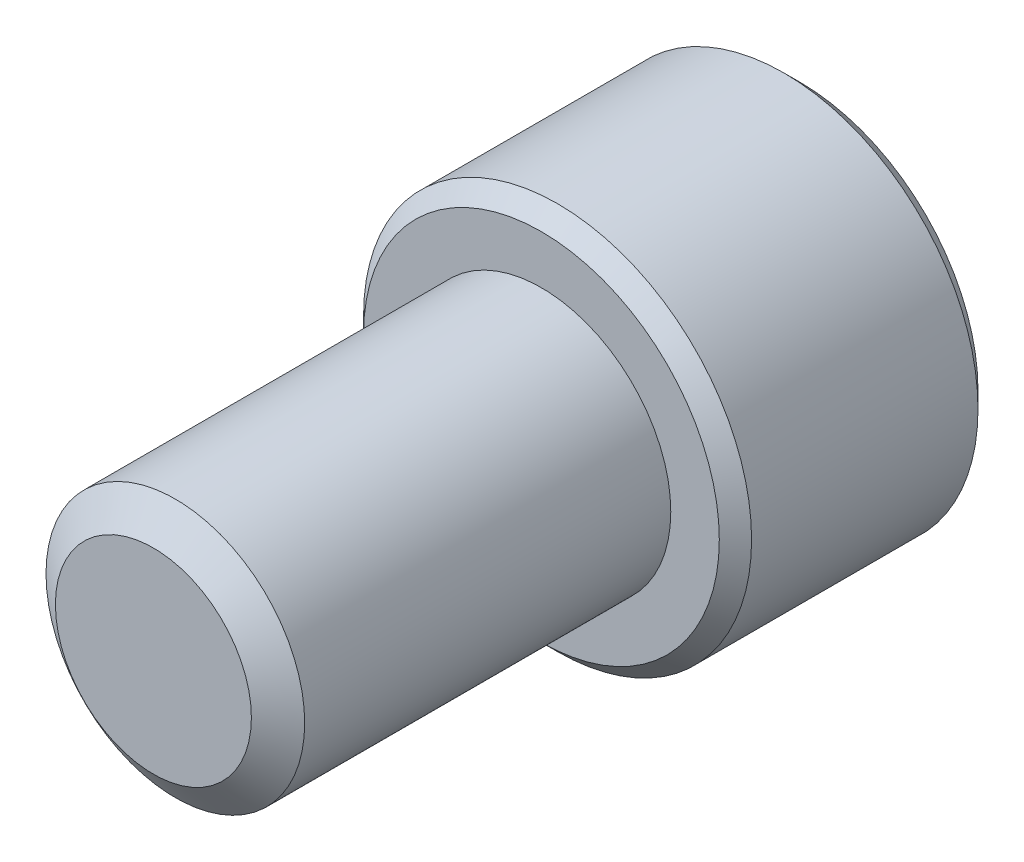
ISO-10303-21;
HEADER;
FILE_DESCRIPTION(('STEP AP214'),'2;1');
FILE_NAME('part.step','',(''),(''),'','','');
FILE_SCHEMA(('AUTOMOTIVE_DESIGN { 1 0 10303 214 1 1 1 1 }'));
ENDSEC;
DATA;
#1=APPLICATION_CONTEXT('core data for automotive mechanical design processes');
#2=APPLICATION_PROTOCOL_DEFINITION('international standard','automotive_design',2000,#1);
#3=PRODUCT_CONTEXT('',#1,'mechanical');
#4=PRODUCT('Part','Part','',(#3));
#5=PRODUCT_RELATED_PRODUCT_CATEGORY('part','',(#4));
#6=PRODUCT_DEFINITION_FORMATION('','',#4);
#7=PRODUCT_DEFINITION_CONTEXT('part definition',#1,'design');
#8=PRODUCT_DEFINITION('design','',#6,#7);
#9=PRODUCT_DEFINITION_SHAPE('','',#8);
#10=(LENGTH_UNIT() NAMED_UNIT(*) SI_UNIT(.MILLI.,.METRE.));
#11=(NAMED_UNIT(*) PLANE_ANGLE_UNIT() SI_UNIT($,.RADIAN.));
#12=(NAMED_UNIT(*) SI_UNIT($,.STERADIAN.) SOLID_ANGLE_UNIT());
#13=UNCERTAINTY_MEASURE_WITH_UNIT(LENGTH_MEASURE(1.E-05),#10,'distance_accuracy_value','');
#14=(GEOMETRIC_REPRESENTATION_CONTEXT(3) GLOBAL_UNCERTAINTY_ASSIGNED_CONTEXT((#13)) GLOBAL_UNIT_ASSIGNED_CONTEXT((#10,
#11,#12)) REPRESENTATION_CONTEXT('',''));
#15=CARTESIAN_POINT('',(0.,0.,0.));
#16=DIRECTION('',(0.,0.,1.));
#17=DIRECTION('',(1.,0.,0.));
#18=AXIS2_PLACEMENT_3D('',#15,#16,#17);
#19=CARTESIAN_POINT('',(0.,0.,-6.35));
#20=DIRECTION('',(0.,0.,1.));
#21=DIRECTION('',(1.,0.,0.));
#22=AXIS2_PLACEMENT_3D('',#19,#20,#21);
#23=PLANE('',#22);
#24=CARTESIAN_POINT('',(0.,0.,-6.35));
#25=DIRECTION('',(0.,0.,1.));
#26=DIRECTION('',(1.,0.,0.));
#27=AXIS2_PLACEMENT_3D('',#24,#25,#26);
#28=CIRCLE('',#27,4.36626);
#29=CARTESIAN_POINT('',(4.36626,0.,-6.35));
#30=VERTEX_POINT('',#29);
#31=EDGE_CURVE('E11',#30,#30,#28,.F.);
#32=ORIENTED_EDGE('',*,*,#31,.T.);
#33=EDGE_LOOP('',(#32));
#34=FACE_BOUND('',#33,.T.);
#35=CARTESIAN_POINT('',(0.,0.,-6.35));
#36=DIRECTION('',(0.,0.,-1.));
#37=DIRECTION('',(-1.,0.,0.));
#38=AXIS2_PLACEMENT_3D('',#35,#36,#37);
#39=CIRCLE('',#38,2.74963065701559);
#40=CARTESIAN_POINT('',(2.38125,1.3748153285078,-6.35));
#41=VERTEX_POINT('',#40);
#42=CARTESIAN_POINT('',(2.38125,-1.3748153285078,-6.35));
#43=VERTEX_POINT('',#42);
#44=EDGE_CURVE('E61',#41,#43,#39,.T.);
#45=ORIENTED_EDGE('',*,*,#44,.F.);
#46=CARTESIAN_POINT('',(0.,2.74963065701559,-6.35));
#47=VERTEX_POINT('',#46);
#48=EDGE_CURVE('E143',#47,#41,#39,.T.);
#49=ORIENTED_EDGE('',*,*,#48,.F.);
#50=CARTESIAN_POINT('',(-2.38125,1.3748153285078,-6.35));
#51=VERTEX_POINT('',#50);
#52=EDGE_CURVE('E138',#51,#47,#39,.T.);
#53=ORIENTED_EDGE('',*,*,#52,.F.);
#54=CARTESIAN_POINT('',(-2.38125,-1.3748153285078,-6.35));
#55=VERTEX_POINT('',#54);
#56=EDGE_CURVE('E102',#55,#51,#39,.T.);
#57=ORIENTED_EDGE('',*,*,#56,.F.);
#58=CARTESIAN_POINT('',(0.,-2.74963065701559,-6.35));
#59=VERTEX_POINT('',#58);
#60=EDGE_CURVE('E93',#59,#55,#39,.T.);
#61=ORIENTED_EDGE('',*,*,#60,.F.);
#62=EDGE_CURVE('E54',#43,#59,#39,.T.);
#63=ORIENTED_EDGE('',*,*,#62,.F.);
#64=EDGE_LOOP('',(#45,#49,#53,#57,#61,#63));
#65=FACE_BOUND('',#64,.T.);
#66=ADVANCED_FACE('F39',(#34,#65),#23,.F.);
#67=CARTESIAN_POINT('',(0.,0.,9.525));
#68=DIRECTION('',(0.,0.,-1.));
#69=DIRECTION('',(-1.,0.,0.));
#70=AXIS2_PLACEMENT_3D('',#67,#68,#69);
#71=CYLINDRICAL_SURFACE('',#70,3.175);
#72=CARTESIAN_POINT('',(0.,0.,8.98615127117986));
#73=DIRECTION('',(0.,0.,-1.));
#74=DIRECTION('',(-1.,0.,0.));
#75=AXIS2_PLACEMENT_3D('',#72,#73,#74);
#76=CIRCLE('',#75,3.175);
#77=CARTESIAN_POINT('',(-3.175,0.,8.98615127117986));
#78=VERTEX_POINT('',#77);
#79=EDGE_CURVE('E185',#78,#78,#76,.T.);
#80=CARTESIAN_POINT('',(0.,0.,0.));
#81=DIRECTION('',(0.,0.,1.));
#82=DIRECTION('',(1.,0.,0.));
#83=AXIS2_PLACEMENT_3D('',#80,#81,#82);
#84=CIRCLE('',#83,3.175);
#85=CARTESIAN_POINT('',(-3.175,0.,0.));
#86=VERTEX_POINT('',#85);
#87=EDGE_CURVE('E184',#86,#86,#84,.T.);
#88=CARTESIAN_POINT('',(-3.175,0.,8.98615127117986));
#89=CARTESIAN_POINT('',(-3.175,0.,8.89254552877174));
#90=CARTESIAN_POINT('',(-3.175,0.,8.79893978636361));
#91=CARTESIAN_POINT('',(-3.175,0.,8.61172830154737));
#92=CARTESIAN_POINT('',(-3.175,0.,8.51812255913924));
#93=CARTESIAN_POINT('',(-3.175,0.,8.330911074323));
#94=CARTESIAN_POINT('',(-3.175,0.,8.23730533191487));
#95=CARTESIAN_POINT('',(-3.175,0.,8.05009384709862));
#96=CARTESIAN_POINT('',(-3.175,0.,7.9564881046905));
#97=CARTESIAN_POINT('',(-3.175,0.,7.76927661987425));
#98=CARTESIAN_POINT('',(-3.175,0.,7.67567087746613));
#99=CARTESIAN_POINT('',(-3.175,0.,7.48845939264988));
#100=CARTESIAN_POINT('',(-3.175,0.,7.39485365024176));
#101=CARTESIAN_POINT('',(-3.175,0.,7.20764216542551));
#102=CARTESIAN_POINT('',(-3.175,0.,7.11403642301739));
#103=CARTESIAN_POINT('',(-3.175,0.,6.92682493820114));
#104=CARTESIAN_POINT('',(-3.175,0.,6.83321919579302));
#105=CARTESIAN_POINT('',(-3.175,0.,6.64600771097677));
#106=CARTESIAN_POINT('',(-3.175,0.,6.55240196856865));
#107=CARTESIAN_POINT('',(-3.175,0.,6.3651904837524));
#108=CARTESIAN_POINT('',(-3.175,0.,6.27158474134428));
#109=CARTESIAN_POINT('',(-3.175,0.,6.08437325652803));
#110=CARTESIAN_POINT('',(-3.175,0.,5.99076751411991));
#111=CARTESIAN_POINT('',(-3.175,0.,5.80355602930366));
#112=CARTESIAN_POINT('',(-3.175,0.,5.70995028689554));
#113=CARTESIAN_POINT('',(-3.175,0.,5.52273880207929));
#114=CARTESIAN_POINT('',(-3.175,0.,5.42913305967117));
#115=CARTESIAN_POINT('',(-3.175,0.,5.24192157485492));
#116=CARTESIAN_POINT('',(-3.175,0.,5.1483158324468));
#117=CARTESIAN_POINT('',(-3.175,0.,4.96110434763055));
#118=CARTESIAN_POINT('',(-3.175,0.,4.86749860522242));
#119=CARTESIAN_POINT('',(-3.175,0.,4.68028712040618));
#120=CARTESIAN_POINT('',(-3.175,0.,4.58668137799805));
#121=CARTESIAN_POINT('',(-3.175,0.,4.39946989318181));
#122=CARTESIAN_POINT('',(-3.175,0.,4.30586415077368));
#123=CARTESIAN_POINT('',(-3.175,0.,4.11865266595744));
#124=CARTESIAN_POINT('',(-3.175,0.,4.02504692354931));
#125=CARTESIAN_POINT('',(-3.175,0.,3.83783543873307));
#126=CARTESIAN_POINT('',(-3.175,0.,3.74422969632494));
#127=CARTESIAN_POINT('',(-3.175,0.,3.55701821150869));
#128=CARTESIAN_POINT('',(-3.175,0.,3.46341246910057));
#129=CARTESIAN_POINT('',(-3.175,0.,3.27620098428432));
#130=CARTESIAN_POINT('',(-3.175,0.,3.1825952418762));
#131=CARTESIAN_POINT('',(-3.175,0.,2.99538375705995));
#132=CARTESIAN_POINT('',(-3.175,0.,2.90177801465183));
#133=CARTESIAN_POINT('',(-3.175,0.,2.71456652983558));
#134=CARTESIAN_POINT('',(-3.175,0.,2.62096078742746));
#135=CARTESIAN_POINT('',(-3.175,0.,2.43374930261121));
#136=CARTESIAN_POINT('',(-3.175,0.,2.34014356020309));
#137=CARTESIAN_POINT('',(-3.175,0.,2.15293207538684));
#138=CARTESIAN_POINT('',(-3.175,0.,2.05932633297872));
#139=CARTESIAN_POINT('',(-3.175,0.,1.87211484816247));
#140=CARTESIAN_POINT('',(-3.175,0.,1.77850910575435));
#141=CARTESIAN_POINT('',(-3.175,0.,1.5912976209381));
#142=CARTESIAN_POINT('',(-3.175,0.,1.49769187852998));
#143=CARTESIAN_POINT('',(-3.175,0.,1.31048039371373));
#144=CARTESIAN_POINT('',(-3.175,0.,1.21687465130561));
#145=CARTESIAN_POINT('',(-3.175,0.,1.02966316648936));
#146=CARTESIAN_POINT('',(-3.175,0.,0.936057424081235));
#147=CARTESIAN_POINT('',(-3.175,0.,0.748845939264988));
#148=CARTESIAN_POINT('',(-3.175,0.,0.655240196856864));
#149=CARTESIAN_POINT('',(-3.175,0.,0.468028712040617));
#150=CARTESIAN_POINT('',(-3.175,0.,0.374422969632494));
#151=CARTESIAN_POINT('',(-3.175,0.,0.187211484816247));
#152=CARTESIAN_POINT('',(-3.175,0.,0.0936057424081236));
#153=CARTESIAN_POINT('',(-3.175,0.,0.));
#154=B_SPLINE_CURVE_WITH_KNOTS('',3,(#88,#89,#90,#91,#92,#93,#94,#95,#96,#97,#98,#99,#100,#101,
#102,#103,#104,#105,#106,#107,#108,#109,#110,#111,#112,#113,#114,#115,#116,#117,#118,#119,#120,
#121,#122,#123,#124,#125,#126,#127,#128,#129,#130,#131,#132,#133,#134,#135,#136,#137,#138,#139,
#140,#141,#142,#143,#144,#145,#146,#147,#148,#149,#150,#151,#152,#153),.UNSPECIFIED.,.F.,.F.,(4,
2,2,2,2,2,2,2,2,2,2,2,2,2,2,2,2,2,2,2,2,2,2,2,2,2,2,2,2,2,2,2,4),(0.,0.28081722722437,
0.561634454448741,0.842451681673111,1.12326890889748,1.40408613612185,1.68490336334622,
1.96572059057059,2.24653781779496,2.52735504501933,2.80817227224371,3.08898949946808,
3.36980672669245,3.65062395391682,3.93144118114119,4.21225840836556,4.49307563558993,
4.7738928628143,5.05471009003867,5.33552731726304,5.61634454448741,5.89716177171178,
6.17797899893615,6.45879622616052,6.73961345338489,7.02043068060926,7.30124790783363,
7.58206513505801,7.86288236228238,8.14369958950675,8.42451681673112,8.70533404395549,
8.98615127117986),.UNSPECIFIED.);
#155=EDGE_CURVE('BSEAM255',#78,#86,#154,.T.);
#156=ORIENTED_EDGE('',*,*,#79,.T.);
#157=ORIENTED_EDGE('',*,*,#87,.T.);
#158=ORIENTED_EDGE('',*,*,#155,.T.);
#159=ORIENTED_EDGE('',*,*,#155,.F.);
#160=EDGE_LOOP('',(#156,#158,#157,#159));
#161=FACE_BOUND('',#160,.T.);
#162=ADVANCED_FACE('F255',(#161),#71,.T.);
#163=CARTESIAN_POINT('',(0.,0.,9.525));
#164=DIRECTION('',(0.,0.,-1.));
#165=DIRECTION('',(-1.,0.,0.));
#166=AXIS2_PLACEMENT_3D('',#163,#164,#165);
#167=CONICAL_SURFACE('',#166,2.405444262,0.959931088596877);
#168=ORIENTED_EDGE('',*,*,#79,.F.);
#169=EDGE_LOOP('',(#168));
#170=FACE_BOUND('',#169,.T.);
#171=CARTESIAN_POINT('',(0.,0.,9.525));
#172=DIRECTION('',(0.,0.,-1.));
#173=DIRECTION('',(-1.,0.,0.));
#174=AXIS2_PLACEMENT_3D('',#171,#172,#173);
#175=CIRCLE('',#174,2.405444262);
#176=CARTESIAN_POINT('',(-2.405444262,0.,9.525));
#177=VERTEX_POINT('',#176);
#178=EDGE_CURVE('E115',#177,#177,#175,.T.);
#179=ORIENTED_EDGE('',*,*,#178,.T.);
#180=EDGE_LOOP('',(#179));
#181=FACE_BOUND('',#180,.T.);
#182=ADVANCED_FACE('F265',(#170,#181),#167,.T.);
#183=CARTESIAN_POINT('',(0.,0.,9.525));
#184=DIRECTION('',(0.,0.,1.));
#185=DIRECTION('',(1.,0.,0.));
#186=AXIS2_PLACEMENT_3D('',#183,#184,#185);
#187=PLANE('',#186);
#188=ORIENTED_EDGE('',*,*,#178,.F.);
#189=EDGE_LOOP('',(#188));
#190=FACE_BOUND('',#189,.T.);
#191=ADVANCED_FACE('F263',(#190),#187,.T.);
#192=CARTESIAN_POINT('',(0.,0.,-6.35));
#193=DIRECTION('',(0.,0.,1.));
#194=DIRECTION('',(1.,0.,0.));
#195=AXIS2_PLACEMENT_3D('',#192,#193,#194);
#196=CYLINDRICAL_SURFACE('',#195,4.7625);
#197=CARTESIAN_POINT('',(0.,0.,-0.396239999999996));
#198=DIRECTION('',(0.,0.,1.));
#199=DIRECTION('',(1.,0.,0.));
#200=AXIS2_PLACEMENT_3D('',#197,#198,#199);
#201=CIRCLE('',#200,4.7625);
#202=CARTESIAN_POINT('',(4.7625,0.,-0.396239999999997));
#203=VERTEX_POINT('',#202);
#204=EDGE_CURVE('E48',#203,#203,#201,.F.);
#205=CARTESIAN_POINT('',(0.,0.,-5.95376));
#206=DIRECTION('',(0.,0.,1.));
#207=DIRECTION('',(1.,0.,0.));
#208=AXIS2_PLACEMENT_3D('',#205,#206,#207);
#209=CIRCLE('',#208,4.7625);
#210=CARTESIAN_POINT('',(4.7625,0.,-5.95376));
#211=VERTEX_POINT('',#210);
#212=EDGE_CURVE('E286',#211,#211,#209,.T.);
#213=CARTESIAN_POINT('',(4.7625,0.,-0.396239999999997));
#214=CARTESIAN_POINT('',(4.7625,0.,-0.454130833333331));
#215=CARTESIAN_POINT('',(4.7625,0.,-0.512021666666664));
#216=CARTESIAN_POINT('',(4.7625,0.,-0.627803333333331));
#217=CARTESIAN_POINT('',(4.7625,0.,-0.685694166666665));
#218=CARTESIAN_POINT('',(4.7625,0.,-0.801475833333331));
#219=CARTESIAN_POINT('',(4.7625,0.,-0.859366666666665));
#220=CARTESIAN_POINT('',(4.7625,0.,-0.975148333333332));
#221=CARTESIAN_POINT('',(4.7625,0.,-1.03303916666667));
#222=CARTESIAN_POINT('',(4.7625,0.,-1.14882083333333));
#223=CARTESIAN_POINT('',(4.7625,0.,-1.20671166666666));
#224=CARTESIAN_POINT('',(4.7625,0.,-1.32249333333333));
#225=CARTESIAN_POINT('',(4.7625,0.,-1.38038416666666));
#226=CARTESIAN_POINT('',(4.7625,0.,-1.49616583333333));
#227=CARTESIAN_POINT('',(4.7625,0.,-1.55405666666667));
#228=CARTESIAN_POINT('',(4.7625,0.,-1.66983833333333));
#229=CARTESIAN_POINT('',(4.7625,0.,-1.72772916666667));
#230=CARTESIAN_POINT('',(4.7625,0.,-1.84351083333333));
#231=CARTESIAN_POINT('',(4.7625,0.,-1.90140166666667));
#232=CARTESIAN_POINT('',(4.7625,0.,-2.01718333333333));
#233=CARTESIAN_POINT('',(4.7625,0.,-2.07507416666667));
#234=CARTESIAN_POINT('',(4.7625,0.,-2.19085583333333));
#235=CARTESIAN_POINT('',(4.7625,0.,-2.24874666666667));
#236=CARTESIAN_POINT('',(4.7625,0.,-2.36452833333333));
#237=CARTESIAN_POINT('',(4.7625,0.,-2.42241916666667));
#238=CARTESIAN_POINT('',(4.7625,0.,-2.53820083333333));
#239=CARTESIAN_POINT('',(4.7625,0.,-2.59609166666667));
#240=CARTESIAN_POINT('',(4.7625,0.,-2.71187333333333));
#241=CARTESIAN_POINT('',(4.7625,0.,-2.76976416666667));
#242=CARTESIAN_POINT('',(4.7625,0.,-2.88554583333333));
#243=CARTESIAN_POINT('',(4.7625,0.,-2.94343666666667));
#244=CARTESIAN_POINT('',(4.7625,0.,-3.05921833333333));
#245=CARTESIAN_POINT('',(4.7625,0.,-3.11710916666667));
#246=CARTESIAN_POINT('',(4.7625,0.,-3.23289083333333));
#247=CARTESIAN_POINT('',(4.7625,0.,-3.29078166666667));
#248=CARTESIAN_POINT('',(4.7625,0.,-3.40656333333333));
#249=CARTESIAN_POINT('',(4.7625,0.,-3.46445416666667));
#250=CARTESIAN_POINT('',(4.7625,0.,-3.58023583333333));
#251=CARTESIAN_POINT('',(4.7625,0.,-3.63812666666667));
#252=CARTESIAN_POINT('',(4.7625,0.,-3.75390833333333));
#253=CARTESIAN_POINT('',(4.7625,0.,-3.81179916666667));
#254=CARTESIAN_POINT('',(4.7625,0.,-3.92758083333333));
#255=CARTESIAN_POINT('',(4.7625,0.,-3.98547166666667));
#256=CARTESIAN_POINT('',(4.7625,0.,-4.10125333333333));
#257=CARTESIAN_POINT('',(4.7625,0.,-4.15914416666667));
#258=CARTESIAN_POINT('',(4.7625,0.,-4.27492583333334));
#259=CARTESIAN_POINT('',(4.7625,0.,-4.33281666666667));
#260=CARTESIAN_POINT('',(4.7625,0.,-4.44859833333334));
#261=CARTESIAN_POINT('',(4.7625,0.,-4.50648916666667));
#262=CARTESIAN_POINT('',(4.7625,0.,-4.62227083333334));
#263=CARTESIAN_POINT('',(4.7625,0.,-4.68016166666667));
#264=CARTESIAN_POINT('',(4.7625,0.,-4.79594333333334));
#265=CARTESIAN_POINT('',(4.7625,0.,-4.85383416666667));
#266=CARTESIAN_POINT('',(4.7625,0.,-4.96961583333334));
#267=CARTESIAN_POINT('',(4.7625,0.,-5.02750666666667));
#268=CARTESIAN_POINT('',(4.7625,0.,-5.14328833333334));
#269=CARTESIAN_POINT('',(4.7625,0.,-5.20117916666667));
#270=CARTESIAN_POINT('',(4.7625,0.,-5.31696083333334));
#271=CARTESIAN_POINT('',(4.7625,0.,-5.37485166666667));
#272=CARTESIAN_POINT('',(4.7625,0.,-5.49063333333334));
#273=CARTESIAN_POINT('',(4.7625,0.,-5.54852416666667));
#274=CARTESIAN_POINT('',(4.7625,0.,-5.66430583333334));
#275=CARTESIAN_POINT('',(4.7625,0.,-5.72219666666667));
#276=CARTESIAN_POINT('',(4.7625,0.,-5.83797833333334));
#277=CARTESIAN_POINT('',(4.7625,0.,-5.89586916666667));
#278=CARTESIAN_POINT('',(4.7625,0.,-5.95376));
#279=B_SPLINE_CURVE_WITH_KNOTS('',3,(#213,#214,#215,#216,#217,#218,#219,#220,#221,#222,#223,
#224,#225,#226,#227,#228,#229,#230,#231,#232,#233,#234,#235,#236,#237,#238,#239,#240,#241,#242,
#243,#244,#245,#246,#247,#248,#249,#250,#251,#252,#253,#254,#255,#256,#257,#258,#259,#260,#261,
#262,#263,#264,#265,#266,#267,#268,#269,#270,#271,#272,#273,#274,#275,#276,#277,#278),
.UNSPECIFIED.,.F.,.F.,(4,2,2,2,2,2,2,2,2,2,2,2,2,2,2,2,2,2,2,2,2,2,2,2,2,2,2,2,2,2,2,2,4),(0.,
0.1736725,0.347345000000001,0.521017500000001,0.694690000000001,0.868362500000001,1.042035,
1.2157075,1.38938,1.5630525,1.736725,1.9103975,2.08407,2.2577425,2.431415,2.6050875,2.77876,
2.9524325,3.126105,3.2997775,3.47345,3.6471225,3.820795,3.9944675,4.16814000000001,4.3418125,
4.51548500000001,4.68915750000001,4.86283000000001,5.03650250000001,5.21017500000001,
5.38384750000001,5.55752000000001),.UNSPECIFIED.);
#280=EDGE_CURVE('BSEAM259',#203,#211,#279,.T.);
#281=ORIENTED_EDGE('',*,*,#204,.T.);
#282=ORIENTED_EDGE('',*,*,#212,.T.);
#283=ORIENTED_EDGE('',*,*,#280,.T.);
#284=ORIENTED_EDGE('',*,*,#280,.F.);
#285=EDGE_LOOP('',(#281,#283,#282,#284));
#286=FACE_BOUND('',#285,.T.);
#287=ADVANCED_FACE('F259',(#286),#196,.T.);
#288=CARTESIAN_POINT('',(0.,0.,0.));
#289=DIRECTION('',(0.,0.,1.));
#290=DIRECTION('',(1.,0.,0.));
#291=AXIS2_PLACEMENT_3D('',#288,#289,#290);
#292=PLANE('',#291);
#293=CARTESIAN_POINT('',(0.,0.,0.));
#294=DIRECTION('',(0.,0.,1.));
#295=DIRECTION('',(1.,0.,0.));
#296=AXIS2_PLACEMENT_3D('',#293,#294,#295);
#297=CIRCLE('',#296,4.36626000000001);
#298=CARTESIAN_POINT('',(4.36626000000001,0.,0.));
#299=VERTEX_POINT('',#298);
#300=EDGE_CURVE('E114',#299,#299,#297,.T.);
#301=ORIENTED_EDGE('',*,*,#300,.T.);
#302=EDGE_LOOP('',(#301));
#303=FACE_BOUND('',#302,.T.);
#304=ORIENTED_EDGE('',*,*,#87,.F.);
#305=EDGE_LOOP('',(#304));
#306=FACE_BOUND('',#305,.T.);
#307=ADVANCED_FACE('F208',(#303,#306),#292,.T.);
#308=CARTESIAN_POINT('',(0.,0.,-6.35));
#309=DIRECTION('',(0.,0.,-1.));
#310=DIRECTION('',(-1.,0.,0.));
#311=AXIS2_PLACEMENT_3D('',#308,#309,#310);
#312=CONICAL_SURFACE('',#311,2.74963065701559,0.78539816339745);
#313=CARTESIAN_POINT('',(-2.38125,5.26358029517608,-9.37753379332385));
#314=CARTESIAN_POINT('',(-2.38125,5.10930015251038,-9.23701195380244));
#315=CARTESIAN_POINT('',(-2.38125,4.95453392247456,-9.09701540692856));
#316=CARTESIAN_POINT('',(-2.38125,4.64362340229069,-8.8184808663705));
#317=CARTESIAN_POINT('',(-2.38125,4.48747876533903,-8.67994326015878));
#318=CARTESIAN_POINT('',(-2.38125,4.17229413784948,-8.40376426129823));
#319=CARTESIAN_POINT('',(-2.38125,4.0132411687696,-8.26613764041314));
#320=CARTESIAN_POINT('',(-2.38125,3.6928582645039,-7.99359517937762));
#321=CARTESIAN_POINT('',(-2.38125,3.53152864477141,-7.85867896983008));
#322=CARTESIAN_POINT('',(-2.38125,3.22909694198146,-7.61172002820002));
#323=CARTESIAN_POINT('',(-2.38125,3.08841030103137,-7.49917072205403));
#324=CARTESIAN_POINT('',(-2.38125,2.80401035625448,-7.27798053470262));
#325=CARTESIAN_POINT('',(-2.38125,2.66029739371072,-7.16933921648988));
#326=CARTESIAN_POINT('',(-2.38125,2.36895316972996,-6.95778146982453));
#327=CARTESIAN_POINT('',(-2.38125,2.22132743946684,-6.85485753656519));
#328=CARTESIAN_POINT('',(-2.38125,1.99575042508842,-6.7068446959238));
#329=CARTESIAN_POINT('',(-2.38125,1.91988689481301,-6.65857998640861));
#330=CARTESIAN_POINT('',(-2.38125,1.76653746568371,-6.56471055220513));
#331=CARTESIAN_POINT('',(-2.38125,1.68905175736512,-6.51910551747663));
#332=CARTESIAN_POINT('',(-2.38125,1.53466949771021,-6.43261398827359));
#333=CARTESIAN_POINT('',(-2.38125,1.45783175198454,-6.39162390648106));
#334=CARTESIAN_POINT('',(-2.38125,1.30220313555207,-6.31358558318694));
#335=CARTESIAN_POINT('',(-2.38125,1.22341213776886,-6.27653759898802));
#336=CARTESIAN_POINT('',(-2.38125,0.983971040100566,-6.1729000313569));
#337=CARTESIAN_POINT('',(-2.38125,0.819876024913719,-6.11359488919417));
#338=CARTESIAN_POINT('',(-2.38125,0.583490005408386,-6.05117681972876));
#339=CARTESIAN_POINT('',(-2.38125,0.514439171440969,-6.03559321718339));
#340=CARTESIAN_POINT('',(-2.38125,0.375316872822723,-6.01004712525619));
#341=CARTESIAN_POINT('',(-2.38125,0.305245933302838,-6.00008184180396));
#342=CARTESIAN_POINT('',(-2.38125,0.164625272615633,-5.98627960171868));
#343=CARTESIAN_POINT('',(-2.38125,0.0940766563827995,-5.98243151251386));
#344=CARTESIAN_POINT('',(-2.38125,-0.047085282951928,-5.98103899869873));
#345=CARTESIAN_POINT('',(-2.38125,-0.117698606778287,-5.98349464554862));
#346=CARTESIAN_POINT('',(-2.38125,-0.258256812705483,-5.99456009749715));
#347=CARTESIAN_POINT('',(-2.38125,-0.328202919931849,-6.00315459238653));
#348=CARTESIAN_POINT('',(-2.38125,-0.467159413671166,-6.02604217972058));
#349=CARTESIAN_POINT('',(-2.38125,-0.536169580360191,-6.04033658772999));
#350=CARTESIAN_POINT('',(-2.38125,-0.673108303706323,-6.07403203979735));
#351=CARTESIAN_POINT('',(-2.38125,-0.741033552658904,-6.09344636572186));
#352=CARTESIAN_POINT('',(-2.38125,-0.875457064039382,-6.13665094363754));
#353=CARTESIAN_POINT('',(-2.38125,-0.941955399224988,-6.16044097191868));
#354=CARTESIAN_POINT('',(-2.38125,-1.09720553188353,-6.22094477258879));
#355=CARTESIAN_POINT('',(-2.38125,-1.18534380866603,-6.25922682410383));
#356=CARTESIAN_POINT('',(-2.38125,-1.35912797059635,-6.34111766976522));
#357=CARTESIAN_POINT('',(-2.38125,-1.44477250822192,-6.3847292800045));
#358=CARTESIAN_POINT('',(-2.38125,-1.61399334296077,-6.47617325206604));
#359=CARTESIAN_POINT('',(-2.38125,-1.69756491320114,-6.52401429490893));
#360=CARTESIAN_POINT('',(-2.38125,-1.8627460255093,-6.6229181508464));
#361=CARTESIAN_POINT('',(-2.38125,-1.94435590729217,-6.67398040047642));
#362=CARTESIAN_POINT('',(-2.38125,-2.10678198772294,-6.7792077300195));
#363=CARTESIAN_POINT('',(-2.38125,-2.18758041921084,-6.83340010959865));
#364=CARTESIAN_POINT('',(-2.38125,-2.34775005808866,-6.9438596011435));
#365=CARTESIAN_POINT('',(-2.38125,-2.42712114832578,-7.00012688226639));
#366=CARTESIAN_POINT('',(-2.38125,-2.66323146084262,-7.17127257527606));
#367=CARTESIAN_POINT('',(-2.38125,-2.81817146870916,-7.28862982679241));
#368=CARTESIAN_POINT('',(-2.38125,-3.17313503051944,-7.56562022097031));
#369=CARTESIAN_POINT('',(-2.38125,-3.37188789584745,-7.72686629825722));
#370=CARTESIAN_POINT('',(-2.38125,-3.7654499045081,-8.05425683146461));
#371=CARTESIAN_POINT('',(-2.38125,-3.96025709131236,-8.22040362181233));
#372=CARTESIAN_POINT('',(-2.38125,-4.34091047965594,-8.5506422019652));
#373=CARTESIAN_POINT('',(-2.38125,-4.5268450884815,-8.71463243608961));
#374=CARTESIAN_POINT('',(-2.38125,-4.80421320104173,-8.96218760206474));
#375=CARTESIAN_POINT('',(-2.38125,-4.89637855982019,-9.0449355980209));
#376=CARTESIAN_POINT('',(-2.38125,-5.08028307881721,-9.21090072213519));
#377=CARTESIAN_POINT('',(-2.38125,-5.17202224651516,-9.29411784200333));
#378=CARTESIAN_POINT('',(-2.38125,-5.26358029517609,-9.37753379332385));
#379=B_SPLINE_CURVE_WITH_KNOTS('',3,(#313,#314,#315,#316,#317,#318,#319,#320,#321,#322,#323,
#324,#325,#326,#327,#328,#329,#330,#331,#332,#333,#334,#335,#336,#337,#338,#339,#340,#341,#342,
#343,#344,#345,#346,#347,#348,#349,#350,#351,#352,#353,#354,#355,#356,#357,#358,#359,#360,#361,
#362,#363,#364,#365,#366,#367,#368,#369,#370,#371,#372,#373,#374,#375,#376,#377,#378),
.UNSPECIFIED.,.F.,.F.,(4,2,2,2,2,2,2,2,2,2,2,2,2,2,2,2,2,2,2,2,2,2,2,2,2,2,2,2,2,2,2,2,4),(0.,
0.626057424372391,1.252277126859,1.883247459247,2.5141312063009,3.0545811320318,3.5949704333503,
4.1346327752944,4.40433562020152,4.6740069625509,4.93515363363657,5.19631733945355,
5.71733835300007,5.92951506380543,6.14158616281034,6.35327087377645,6.56495798444603,
6.77611898529682,6.98732875126098,7.19909191210817,7.41084424946199,7.69888178894536,
7.98707218845073,8.27586848513108,8.56461440390024,8.8564420804433,9.14829360118405,
9.7312641134934,10.4989529499474,11.2670135719832,12.0107502436479,12.3823337365477,
12.7539106835658),.UNSPECIFIED.);
#380=EDGE_CURVE('E107',#51,#55,#379,.T.);
#381=ORIENTED_EDGE('',*,*,#380,.T.);
#382=ORIENTED_EDGE('',*,*,#56,.T.);
#383=EDGE_LOOP('',(#381,#382));
#384=FACE_BOUND('',#383,.T.);
#385=ADVANCED_FACE('F108',(#384),#312,.F.);
#386=CARTESIAN_POINT('',(0.000199999999999783,2.74974612706943,-6.35011547732724));
#387=CARTESIAN_POINT('',(-0.0816567823790502,2.70248609172789,-6.30289489670954));
#388=CARTESIAN_POINT('',(-0.16488233377176,2.65443579722785,-6.2584475752929));
#389=CARTESIAN_POINT('',(-0.33458848083804,2.556455907536,-6.17706545698558));
#390=CARTESIAN_POINT('',(-0.421085217353102,2.50651699342501,-6.14017594309514));
#391=CARTESIAN_POINT('',(-0.595501774009041,2.40581754748857,-6.07698341316591));
#392=CARTESIAN_POINT('',(-0.683377171180674,2.35508266327639,-6.05052155872948));
#393=CARTESIAN_POINT('',(-0.861062594070875,2.25249593653966,-6.00975151561606));
#394=CARTESIAN_POINT('',(-0.95086719118587,2.20064722822085,-5.99541289153055));
#395=CARTESIAN_POINT('',(-1.10563960313034,2.11128933452158,-5.98247578477011));
#396=CARTESIAN_POINT('',(-1.17040744896962,2.07389560129144,-5.98056060465318));
#397=CARTESIAN_POINT('',(-1.29983727933557,1.99916925388849,-5.98378662276768));
#398=CARTESIAN_POINT('',(-1.36449921879335,1.96183666573622,-5.98893029485709));
#399=CARTESIAN_POINT('',(-1.4932125485774,1.88752399013711,-6.00598131087164));
#400=CARTESIAN_POINT('',(-1.55726317423485,1.85054434417201,-6.01789622134933));
#401=CARTESIAN_POINT('',(-1.68425683890527,1.77722451768917,-6.04783567235203));
#402=CARTESIAN_POINT('',(-1.74719996243582,1.74088428837517,-6.06585974451845));
#403=CARTESIAN_POINT('',(-1.90842615073218,1.64780030516185,-6.11936880755241));
#404=CARTESIAN_POINT('',(-2.00570949128784,1.59163374230437,-6.15888742087218));
#405=CARTESIAN_POINT('',(-2.14875606262557,1.50904576583588,-6.2256003435508));
#406=CARTESIAN_POINT('',(-2.19589628894396,1.48182934348129,-6.24904020911133));
#407=CARTESIAN_POINT('',(-2.28930352636664,1.42790064981105,-6.29805667665953));
#408=CARTESIAN_POINT('',(-2.33557105249682,1.40118808114506,-6.32363196676685));
#409=CARTESIAN_POINT('',(-2.38145,1.37469985845396,-6.35011547732724));
#410=B_SPLINE_CURVE_WITH_KNOTS('',3,(#386,#387,#388,#389,#390,#391,#392,#393,#394,#395,#396,
#397,#398,#399,#400,#401,#402,#403,#404,#405,#406,#407,#408,#409),.UNSPECIFIED.,.F.,.F.,(4,2,2,
2,2,2,2,2,2,2,2,4),(0.,0.317196610611949,0.636241461041217,0.95021895062922,1.26340583824126,
1.48752413747844,1.71172100167747,1.93616888974082,2.16059957440836,2.51709639744763,
2.69486147369099,2.87251813383154),.UNSPECIFIED.);
#411=EDGE_CURVE('E142',#47,#51,#410,.T.);
#412=ORIENTED_EDGE('',*,*,#411,.T.);
#413=ORIENTED_EDGE('',*,*,#52,.T.);
#414=EDGE_LOOP('',(#412,#413));
#415=FACE_BOUND('',#414,.T.);
#416=ADVANCED_FACE('F207',(#415),#312,.F.);
#417=CARTESIAN_POINT('',(2.38145,1.37469985845396,-6.35011547732724));
#418=CARTESIAN_POINT('',(2.29959321762095,1.4219598937955,-6.30289489670954));
#419=CARTESIAN_POINT('',(2.21636766622824,1.47001018829554,-6.2584475752929));
#420=CARTESIAN_POINT('',(2.04666151916196,1.56799007798739,-6.17706545698558));
#421=CARTESIAN_POINT('',(1.9601647826469,1.61792899209838,-6.14017594309514));
#422=CARTESIAN_POINT('',(1.78574822599096,1.71862843803482,-6.07698341316591));
#423=CARTESIAN_POINT('',(1.69787282881933,1.769363322247,-6.05052155872948));
#424=CARTESIAN_POINT('',(1.52018740592913,1.87195004898373,-6.00975151561606));
#425=CARTESIAN_POINT('',(1.43038280881413,1.92379875730254,-5.99541289153055));
#426=CARTESIAN_POINT('',(1.27561039686966,2.01315665100181,-5.98247578477011));
#427=CARTESIAN_POINT('',(1.21084255103038,2.05055038423195,-5.98056060465318));
#428=CARTESIAN_POINT('',(1.08141272066443,2.1252767316349,-5.98378662276768));
#429=CARTESIAN_POINT('',(1.01675078120665,2.16260931978717,-5.98893029485709));
#430=CARTESIAN_POINT('',(0.888037451422604,2.23692199538628,-6.00598131087164));
#431=CARTESIAN_POINT('',(0.823986825765147,2.27390164135138,-6.01789622134933));
#432=CARTESIAN_POINT('',(0.696993161094728,2.34722146783422,-6.04783567235203));
#433=CARTESIAN_POINT('',(0.634050037564177,2.38356169714822,-6.06585974451845));
#434=CARTESIAN_POINT('',(0.472823849267819,2.47664568036154,-6.11936880755241));
#435=CARTESIAN_POINT('',(0.375540508712161,2.53281224321902,-6.15888742087218));
#436=CARTESIAN_POINT('',(0.23249393737443,2.61540021968751,-6.2256003435508));
#437=CARTESIAN_POINT('',(0.185353711056036,2.64261664204209,-6.24904020911133));
#438=CARTESIAN_POINT('',(0.0919464736333616,2.69654533571233,-6.29805667665954));
#439=CARTESIAN_POINT('',(0.0456789475031782,2.72325790437833,-6.32363196676685));
#440=CARTESIAN_POINT('',(-0.000200000000000541,2.74974612706943,-6.35011547732724));
#441=B_SPLINE_CURVE_WITH_KNOTS('',3,(#417,#418,#419,#420,#421,#422,#423,#424,#425,#426,#427,
#428,#429,#430,#431,#432,#433,#434,#435,#436,#437,#438,#439,#440),.UNSPECIFIED.,.F.,.F.,(4,2,2,
2,2,2,2,2,2,2,2,4),(0.,0.317196610611949,0.636241461041218,0.950218950629222,1.26340583824126,
1.48752413747844,1.71172100167747,1.93616888974082,2.16059957440836,2.51709639744763,
2.69486147369099,2.87251813383154),.UNSPECIFIED.);
#442=EDGE_CURVE('E148',#41,#47,#441,.T.);
#443=ORIENTED_EDGE('',*,*,#442,.T.);
#444=ORIENTED_EDGE('',*,*,#48,.T.);
#445=EDGE_LOOP('',(#443,#444));
#446=FACE_BOUND('',#445,.T.);
#447=ADVANCED_FACE('F153',(#446),#312,.F.);
#448=CARTESIAN_POINT('',(2.38125,-5.26358029517608,-9.37753379332385));
#449=CARTESIAN_POINT('',(2.38125,-5.10930015251038,-9.23701195380244));
#450=CARTESIAN_POINT('',(2.38125,-4.95453392247456,-9.09701540692856));
#451=CARTESIAN_POINT('',(2.38125,-4.64362340229069,-8.8184808663705));
#452=CARTESIAN_POINT('',(2.38125,-4.48747876533903,-8.67994326015878));
#453=CARTESIAN_POINT('',(2.38125,-4.17229413784948,-8.40376426129823));
#454=CARTESIAN_POINT('',(2.38125,-4.01324116876961,-8.26613764041314));
#455=CARTESIAN_POINT('',(2.38125,-3.6928582645039,-7.99359517937762));
#456=CARTESIAN_POINT('',(2.38125,-3.53152864477141,-7.85867896983008));
#457=CARTESIAN_POINT('',(2.38125,-3.22909694198147,-7.61172002820002));
#458=CARTESIAN_POINT('',(2.38125,-3.08841030103137,-7.49917072205403));
#459=CARTESIAN_POINT('',(2.38125,-2.80401035625448,-7.27798053470262));
#460=CARTESIAN_POINT('',(2.38125,-2.66029739371072,-7.16933921648988));
#461=CARTESIAN_POINT('',(2.38125,-2.36895316972996,-6.95778146982453));
#462=CARTESIAN_POINT('',(2.38125,-2.22132743946685,-6.85485753656519));
#463=CARTESIAN_POINT('',(2.38125,-1.99575042508842,-6.7068446959238));
#464=CARTESIAN_POINT('',(2.38125,-1.91988689481301,-6.65857998640861));
#465=CARTESIAN_POINT('',(2.38125,-1.76653746568372,-6.56471055220514));
#466=CARTESIAN_POINT('',(2.38125,-1.68905175736512,-6.51910551747663));
#467=CARTESIAN_POINT('',(2.38125,-1.53466949771022,-6.43261398827359));
#468=CARTESIAN_POINT('',(2.38125,-1.45783175198455,-6.39162390648107));
#469=CARTESIAN_POINT('',(2.38125,-1.30220313555207,-6.31358558318694));
#470=CARTESIAN_POINT('',(2.38125,-1.22341213776886,-6.27653759898802));
#471=CARTESIAN_POINT('',(2.38125,-0.983971040100569,-6.1729000313569));
#472=CARTESIAN_POINT('',(2.38125,-0.819876024913721,-6.11359488919417));
#473=CARTESIAN_POINT('',(2.38125,-0.583490005408389,-6.05117681972876));
#474=CARTESIAN_POINT('',(2.38125,-0.514439171440971,-6.03559321718339));
#475=CARTESIAN_POINT('',(2.38125,-0.375316872822725,-6.01004712525619));
#476=CARTESIAN_POINT('',(2.38125,-0.30524593330284,-6.00008184180396));
#477=CARTESIAN_POINT('',(2.38125,-0.164625272615635,-5.98627960171868));
#478=CARTESIAN_POINT('',(2.38125,-0.0940766563828018,-5.98243151251386));
#479=CARTESIAN_POINT('',(2.38125,0.0470852829519256,-5.98103899869873));
#480=CARTESIAN_POINT('',(2.38125,0.117698606778285,-5.98349464554862));
#481=CARTESIAN_POINT('',(2.38125,0.258256812705481,-5.99456009749715));
#482=CARTESIAN_POINT('',(2.38125,0.328202919931847,-6.00315459238653));
#483=CARTESIAN_POINT('',(2.38125,0.467159413671164,-6.02604217972058));
#484=CARTESIAN_POINT('',(2.38125,0.536169580360189,-6.04033658772999));
#485=CARTESIAN_POINT('',(2.38125,0.673108303706321,-6.07403203979735));
#486=CARTESIAN_POINT('',(2.38125,0.741033552658902,-6.09344636572186));
#487=CARTESIAN_POINT('',(2.38125,0.87545706403938,-6.13665094363754));
#488=CARTESIAN_POINT('',(2.38125,0.941955399224987,-6.16044097191868));
#489=CARTESIAN_POINT('',(2.38125,1.09720553188353,-6.22094477258879));
#490=CARTESIAN_POINT('',(2.38125,1.18534380866602,-6.25922682410383));
#491=CARTESIAN_POINT('',(2.38125,1.35912797059635,-6.34111766976522));
#492=CARTESIAN_POINT('',(2.38125,1.44477250822192,-6.3847292800045));
#493=CARTESIAN_POINT('',(2.38125,1.61399334296077,-6.47617325206604));
#494=CARTESIAN_POINT('',(2.38125,1.69756491320114,-6.52401429490893));
#495=CARTESIAN_POINT('',(2.38125,1.8627460255093,-6.6229181508464));
#496=CARTESIAN_POINT('',(2.38125,1.94435590729217,-6.67398040047641));
#497=CARTESIAN_POINT('',(2.38125,2.10678198772294,-6.7792077300195));
#498=CARTESIAN_POINT('',(2.38125,2.18758041921084,-6.83340010959865));
#499=CARTESIAN_POINT('',(2.38125,2.34775005808865,-6.94385960114349));
#500=CARTESIAN_POINT('',(2.38125,2.42712114832578,-7.00012688226639));
#501=CARTESIAN_POINT('',(2.38125,2.66323146084261,-7.17127257527606));
#502=CARTESIAN_POINT('',(2.38125,2.81817146870915,-7.28862982679241));
#503=CARTESIAN_POINT('',(2.38125,3.17313503051943,-7.56562022097031));
#504=CARTESIAN_POINT('',(2.38125,3.37188789584745,-7.72686629825722));
#505=CARTESIAN_POINT('',(2.38125,3.76544990450809,-8.0542568314646));
#506=CARTESIAN_POINT('',(2.38125,3.96025709131236,-8.22040362181233));
#507=CARTESIAN_POINT('',(2.38125,4.34091047965594,-8.5506422019652));
#508=CARTESIAN_POINT('',(2.38125,4.52684508848149,-8.71463243608961));
#509=CARTESIAN_POINT('',(2.38125,4.80421320104173,-8.96218760206474));
#510=CARTESIAN_POINT('',(2.38125,4.89637855982019,-9.0449355980209));
#511=CARTESIAN_POINT('',(2.38125,5.08028307881721,-9.21090072213518));
#512=CARTESIAN_POINT('',(2.38125,5.17202224651515,-9.29411784200332));
#513=CARTESIAN_POINT('',(2.38125,5.26358029517608,-9.37753379332385));
#514=B_SPLINE_CURVE_WITH_KNOTS('',3,(#448,#449,#450,#451,#452,#453,#454,#455,#456,#457,#458,
#459,#460,#461,#462,#463,#464,#465,#466,#467,#468,#469,#470,#471,#472,#473,#474,#475,#476,#477,
#478,#479,#480,#481,#482,#483,#484,#485,#486,#487,#488,#489,#490,#491,#492,#493,#494,#495,#496,
#497,#498,#499,#500,#501,#502,#503,#504,#505,#506,#507,#508,#509,#510,#511,#512,#513),
.UNSPECIFIED.,.F.,.F.,(4,2,2,2,2,2,2,2,2,2,2,2,2,2,2,2,2,2,2,2,2,2,2,2,2,2,2,2,2,2,2,2,4),(0.,
0.62605742437239,1.252277126859,1.883247459247,2.5141312063009,3.0545811320318,3.59497043335029,
4.1346327752944,4.40433562020152,4.67400696255089,4.93515363363656,5.19631733945355,
5.71733835300006,5.92951506380543,6.14158616281034,6.35327087377645,6.56495798444603,
6.77611898529681,6.98732875126098,7.19909191210817,7.41084424946198,7.69888178894535,
7.98707218845072,8.27586848513108,8.56461440390024,8.85644208044329,9.14829360118405,
9.7312641134934,10.4989529499474,11.2670135719832,12.0107502436479,12.3823337365477,
12.7539106835658),.UNSPECIFIED.);
#515=EDGE_CURVE('E160',#43,#41,#514,.T.);
#516=ORIENTED_EDGE('',*,*,#515,.T.);
#517=ORIENTED_EDGE('',*,*,#44,.T.);
#518=EDGE_LOOP('',(#516,#517));
#519=FACE_BOUND('',#518,.T.);
#520=ADVANCED_FACE('F382',(#519),#312,.F.);
#521=CARTESIAN_POINT('',(-0.000200000000000867,-2.74974612706943,-6.35011547732724));
#522=CARTESIAN_POINT('',(0.081656782379049,-2.70248609172789,-6.30289489670954));
#523=CARTESIAN_POINT('',(0.164882333771759,-2.65443579722785,-6.2584475752929));
#524=CARTESIAN_POINT('',(0.334588480838038,-2.556455907536,-6.17706545698558));
#525=CARTESIAN_POINT('',(0.421085217353101,-2.50651699342501,-6.14017594309514));
#526=CARTESIAN_POINT('',(0.59550177400904,-2.40581754748857,-6.07698341316591));
#527=CARTESIAN_POINT('',(0.683377171180673,-2.35508266327639,-6.05052155872948));
#528=CARTESIAN_POINT('',(0.861062594070874,-2.25249593653966,-6.00975151561606));
#529=CARTESIAN_POINT('',(0.950867191185869,-2.20064722822085,-5.99541289153055));
#530=CARTESIAN_POINT('',(1.10563960313034,-2.11128933452158,-5.98247578477011));
#531=CARTESIAN_POINT('',(1.17040744896962,-2.07389560129144,-5.98056060465318));
#532=CARTESIAN_POINT('',(1.29983727933557,-1.99916925388849,-5.98378662276768));
#533=CARTESIAN_POINT('',(1.36449921879335,-1.96183666573622,-5.98893029485709));
#534=CARTESIAN_POINT('',(1.49321254857739,-1.88752399013711,-6.00598131087164));
#535=CARTESIAN_POINT('',(1.55726317423485,-1.85054434417201,-6.01789622134933));
#536=CARTESIAN_POINT('',(1.68425683890527,-1.77722451768917,-6.04783567235203));
#537=CARTESIAN_POINT('',(1.74719996243582,-1.74088428837517,-6.06585974451845));
#538=CARTESIAN_POINT('',(1.90842615073218,-1.64780030516185,-6.11936880755241));
#539=CARTESIAN_POINT('',(2.00570949128784,-1.59163374230437,-6.15888742087218));
#540=CARTESIAN_POINT('',(2.14875606262557,-1.50904576583588,-6.2256003435508));
#541=CARTESIAN_POINT('',(2.19589628894396,-1.4818293434813,-6.24904020911134));
#542=CARTESIAN_POINT('',(2.28930352636664,-1.42790064981105,-6.29805667665954));
#543=CARTESIAN_POINT('',(2.33557105249682,-1.40118808114506,-6.32363196676685));
#544=CARTESIAN_POINT('',(2.38145,-1.37469985845396,-6.35011547732724));
#545=B_SPLINE_CURVE_WITH_KNOTS('',3,(#521,#522,#523,#524,#525,#526,#527,#528,#529,#530,#531,
#532,#533,#534,#535,#536,#537,#538,#539,#540,#541,#542,#543,#544),.UNSPECIFIED.,.F.,.F.,(4,2,2,
2,2,2,2,2,2,2,2,4),(0.,0.317196610611948,0.636241461041217,0.950218950629221,1.26340583824126,
1.48752413747844,1.71172100167747,1.93616888974082,2.16059957440836,2.51709639744763,
2.69486147369099,2.87251813383154),.UNSPECIFIED.);
#546=EDGE_CURVE('E128',#59,#43,#545,.T.);
#547=ORIENTED_EDGE('',*,*,#546,.T.);
#548=ORIENTED_EDGE('',*,*,#62,.T.);
#549=EDGE_LOOP('',(#547,#548));
#550=FACE_BOUND('',#549,.T.);
#551=ADVANCED_FACE('F374',(#550),#312,.F.);
#552=CARTESIAN_POINT('',(-2.38145,-1.37469985845396,-6.35011547732724));
#553=CARTESIAN_POINT('',(-2.29959321762095,-1.4219598937955,-6.30289489670954));
#554=CARTESIAN_POINT('',(-2.21636766622824,-1.47001018829554,-6.2584475752929));
#555=CARTESIAN_POINT('',(-2.04666151916196,-1.56799007798739,-6.17706545698558));
#556=CARTESIAN_POINT('',(-1.9601647826469,-1.61792899209838,-6.14017594309514));
#557=CARTESIAN_POINT('',(-1.78574822599096,-1.71862843803482,-6.07698341316591));
#558=CARTESIAN_POINT('',(-1.69787282881933,-1.769363322247,-6.05052155872948));
#559=CARTESIAN_POINT('',(-1.52018740592913,-1.87195004898373,-6.00975151561606));
#560=CARTESIAN_POINT('',(-1.43038280881413,-1.92379875730254,-5.99541289153055));
#561=CARTESIAN_POINT('',(-1.27561039686966,-2.01315665100181,-5.98247578477011));
#562=CARTESIAN_POINT('',(-1.21084255103038,-2.05055038423195,-5.98056060465318));
#563=CARTESIAN_POINT('',(-1.08141272066443,-2.1252767316349,-5.98378662276768));
#564=CARTESIAN_POINT('',(-1.01675078120665,-2.16260931978717,-5.98893029485709));
#565=CARTESIAN_POINT('',(-0.888037451422605,-2.23692199538628,-6.00598131087164));
#566=CARTESIAN_POINT('',(-0.823986825765148,-2.27390164135138,-6.01789622134933));
#567=CARTESIAN_POINT('',(-0.696993161094729,-2.34722146783422,-6.04783567235203));
#568=CARTESIAN_POINT('',(-0.634050037564178,-2.38356169714822,-6.06585974451845));
#569=CARTESIAN_POINT('',(-0.47282384926782,-2.47664568036154,-6.11936880755241));
#570=CARTESIAN_POINT('',(-0.375540508712162,-2.53281224321902,-6.15888742087218));
#571=CARTESIAN_POINT('',(-0.232493937374431,-2.61540021968751,-6.2256003435508));
#572=CARTESIAN_POINT('',(-0.185353711056036,-2.64261664204209,-6.24904020911133));
#573=CARTESIAN_POINT('',(-0.0919464736333624,-2.69654533571233,-6.29805667665953));
#574=CARTESIAN_POINT('',(-0.0456789475031791,-2.72325790437833,-6.32363196676685));
#575=CARTESIAN_POINT('',(0.000199999999999277,-2.74974612706943,-6.35011547732724));
#576=B_SPLINE_CURVE_WITH_KNOTS('',3,(#552,#553,#554,#555,#556,#557,#558,#559,#560,#561,#562,
#563,#564,#565,#566,#567,#568,#569,#570,#571,#572,#573,#574,#575),.UNSPECIFIED.,.F.,.F.,(4,2,2,
2,2,2,2,2,2,2,2,4),(0.,0.317196610611948,0.636241461041217,0.95021895062922,1.26340583824126,
1.48752413747844,1.71172100167747,1.93616888974082,2.16059957440836,2.51709639744763,
2.69486147369099,2.87251813383154),.UNSPECIFIED.);
#577=EDGE_CURVE('E97',#55,#59,#576,.T.);
#578=ORIENTED_EDGE('',*,*,#577,.T.);
#579=ORIENTED_EDGE('',*,*,#60,.T.);
#580=EDGE_LOOP('',(#578,#579));
#581=FACE_BOUND('',#580,.T.);
#582=ADVANCED_FACE('F95',(#581),#312,.F.);
#583=CARTESIAN_POINT('',(0.,0.,-2.778125));
#584=DIRECTION('',(0.,0.,1.));
#585=DIRECTION('',(1.,0.,0.));
#586=AXIS2_PLACEMENT_3D('',#583,#584,#585);
#587=PLANE('',#586);
#588=DIRECTION('',(0.866025403784439,-0.5,0.));
#589=VECTOR('',#588,1.);
#590=CARTESIAN_POINT('',(-1.190625,-2.0622229927617,-2.778125));
#591=LINE('',#590,#589);
#592=CARTESIAN_POINT('',(-2.38125,-1.3748153285078,-2.778125));
#593=VERTEX_POINT('',#592);
#594=CARTESIAN_POINT('',(0.,-2.74963065701559,-2.778125));
#595=VERTEX_POINT('',#594);
#596=EDGE_CURVE('E127',#593,#595,#591,.T.);
#597=ORIENTED_EDGE('',*,*,#596,.F.);
#598=DIRECTION('',(0.,-1.,0.));
#599=VECTOR('',#598,1.);
#600=CARTESIAN_POINT('',(-2.38125,0.,-2.778125));
#601=LINE('',#600,#599);
#602=CARTESIAN_POINT('',(-2.38125,1.3748153285078,-2.778125));
#603=VERTEX_POINT('',#602);
#604=EDGE_CURVE('E132',#603,#593,#601,.T.);
#605=ORIENTED_EDGE('',*,*,#604,.F.);
#606=DIRECTION('',(-0.866025403784439,-0.5,0.));
#607=VECTOR('',#606,1.);
#608=CARTESIAN_POINT('',(-1.190625,2.06222299276169,-2.778125));
#609=LINE('',#608,#607);
#610=CARTESIAN_POINT('',(0.,2.74963065701559,-2.778125));
#611=VERTEX_POINT('',#610);
#612=EDGE_CURVE('E446',#611,#603,#609,.T.);
#613=ORIENTED_EDGE('',*,*,#612,.F.);
#614=DIRECTION('',(-0.866025403784439,0.5,0.));
#615=VECTOR('',#614,1.);
#616=CARTESIAN_POINT('',(1.190625,2.06222299276169,-2.778125));
#617=LINE('',#616,#615);
#618=CARTESIAN_POINT('',(2.38125,1.3748153285078,-2.778125));
#619=VERTEX_POINT('',#618);
#620=EDGE_CURVE('E169',#619,#611,#617,.T.);
#621=ORIENTED_EDGE('',*,*,#620,.F.);
#622=DIRECTION('',(0.,1.,0.));
#623=VECTOR('',#622,1.);
#624=CARTESIAN_POINT('',(2.38125,0.,-2.778125));
#625=LINE('',#624,#623);
#626=CARTESIAN_POINT('',(2.38125,-1.3748153285078,-2.778125));
#627=VERTEX_POINT('',#626);
#628=EDGE_CURVE('E439',#627,#619,#625,.T.);
#629=ORIENTED_EDGE('',*,*,#628,.F.);
#630=DIRECTION('',(0.866025403784439,0.5,0.));
#631=VECTOR('',#630,1.);
#632=CARTESIAN_POINT('',(1.190625,-2.06222299276169,-2.778125));
#633=LINE('',#632,#631);
#634=EDGE_CURVE('E436',#595,#627,#633,.T.);
#635=ORIENTED_EDGE('',*,*,#634,.F.);
#636=EDGE_LOOP('',(#597,#605,#613,#621,#629,#635));
#637=FACE_BOUND('',#636,.T.);
#638=ADVANCED_FACE('F209',(#637),#587,.F.);
#639=CARTESIAN_POINT('',(-2.38125,0.,-2.778125));
#640=DIRECTION('',(1.,0.,0.));
#641=DIRECTION('',(0.,0.,-1.));
#642=AXIS2_PLACEMENT_3D('',#639,#640,#641);
#643=PLANE('',#642);
#644=ORIENTED_EDGE('',*,*,#380,.F.);
#645=DIRECTION('',(0.,0.,-1.));
#646=VECTOR('',#645,1.);
#647=CARTESIAN_POINT('',(-2.38125,1.3748153285078,-2.778125));
#648=LINE('',#647,#646);
#649=EDGE_CURVE('E134',#603,#51,#648,.T.);
#650=ORIENTED_EDGE('',*,*,#649,.F.);
#651=ORIENTED_EDGE('',*,*,#604,.T.);
#652=DIRECTION('',(0.,0.,-1.));
#653=VECTOR('',#652,1.);
#654=CARTESIAN_POINT('',(-2.38125,-1.3748153285078,-2.778125));
#655=LINE('',#654,#653);
#656=EDGE_CURVE('E122',#593,#55,#655,.T.);
#657=ORIENTED_EDGE('',*,*,#656,.T.);
#658=EDGE_LOOP('',(#644,#650,#651,#657));
#659=FACE_BOUND('',#658,.T.);
#660=ADVANCED_FACE('F130',(#659),#643,.T.);
#661=CARTESIAN_POINT('',(-1.190625,2.06222299276169,-2.778125));
#662=DIRECTION('',(0.5,-0.866025403784439,0.));
#663=DIRECTION('',(0.866025403784439,0.5,0.));
#664=AXIS2_PLACEMENT_3D('',#661,#662,#663);
#665=PLANE('',#664);
#666=ORIENTED_EDGE('',*,*,#411,.F.);
#667=DIRECTION('',(0.,0.,-1.));
#668=VECTOR('',#667,1.);
#669=CARTESIAN_POINT('',(0.,2.74963065701559,-2.778125));
#670=LINE('',#669,#668);
#671=EDGE_CURVE('E165',#611,#47,#670,.T.);
#672=ORIENTED_EDGE('',*,*,#671,.F.);
#673=ORIENTED_EDGE('',*,*,#612,.T.);
#674=ORIENTED_EDGE('',*,*,#649,.T.);
#675=EDGE_LOOP('',(#666,#672,#673,#674));
#676=FACE_BOUND('',#675,.T.);
#677=ADVANCED_FACE('F164',(#676),#665,.T.);
#678=CARTESIAN_POINT('',(1.190625,2.06222299276169,-2.778125));
#679=DIRECTION('',(-0.5,-0.866025403784439,0.));
#680=DIRECTION('',(0.866025403784439,-0.5,0.));
#681=AXIS2_PLACEMENT_3D('',#678,#679,#680);
#682=PLANE('',#681);
#683=ORIENTED_EDGE('',*,*,#442,.F.);
#684=DIRECTION('',(0.,0.,-1.));
#685=VECTOR('',#684,1.);
#686=CARTESIAN_POINT('',(2.38125,1.3748153285078,-2.778125));
#687=LINE('',#686,#685);
#688=EDGE_CURVE('E171',#619,#41,#687,.T.);
#689=ORIENTED_EDGE('',*,*,#688,.F.);
#690=ORIENTED_EDGE('',*,*,#620,.T.);
#691=ORIENTED_EDGE('',*,*,#671,.T.);
#692=EDGE_LOOP('',(#683,#689,#690,#691));
#693=FACE_BOUND('',#692,.T.);
#694=ADVANCED_FACE('F167',(#693),#682,.T.);
#695=CARTESIAN_POINT('',(2.38125,0.,-2.778125));
#696=DIRECTION('',(-1.,0.,0.));
#697=DIRECTION('',(0.,-1.,0.));
#698=AXIS2_PLACEMENT_3D('',#695,#696,#697);
#699=PLANE('',#698);
#700=ORIENTED_EDGE('',*,*,#515,.F.);
#701=DIRECTION('',(0.,0.,-1.));
#702=VECTOR('',#701,1.);
#703=CARTESIAN_POINT('',(2.38125,-1.3748153285078,-2.778125));
#704=LINE('',#703,#702);
#705=EDGE_CURVE('E175',#627,#43,#704,.T.);
#706=ORIENTED_EDGE('',*,*,#705,.F.);
#707=ORIENTED_EDGE('',*,*,#628,.T.);
#708=ORIENTED_EDGE('',*,*,#688,.T.);
#709=EDGE_LOOP('',(#700,#706,#707,#708));
#710=FACE_BOUND('',#709,.T.);
#711=ADVANCED_FACE('F246',(#710),#699,.T.);
#712=CARTESIAN_POINT('',(1.190625,-2.06222299276169,-2.778125));
#713=DIRECTION('',(-0.5,0.866025403784439,0.));
#714=DIRECTION('',(-0.866025403784439,-0.5,0.));
#715=AXIS2_PLACEMENT_3D('',#712,#713,#714);
#716=PLANE('',#715);
#717=ORIENTED_EDGE('',*,*,#546,.F.);
#718=DIRECTION('',(0.,0.,-1.));
#719=VECTOR('',#718,1.);
#720=CARTESIAN_POINT('',(0.,-2.74963065701559,-2.778125));
#721=LINE('',#720,#719);
#722=EDGE_CURVE('E125',#595,#59,#721,.T.);
#723=ORIENTED_EDGE('',*,*,#722,.F.);
#724=ORIENTED_EDGE('',*,*,#634,.T.);
#725=ORIENTED_EDGE('',*,*,#705,.T.);
#726=EDGE_LOOP('',(#717,#723,#724,#725));
#727=FACE_BOUND('',#726,.T.);
#728=ADVANCED_FACE('F243',(#727),#716,.T.);
#729=CARTESIAN_POINT('',(-1.190625,-2.0622229927617,-2.778125));
#730=DIRECTION('',(0.5,0.866025403784439,0.));
#731=DIRECTION('',(-0.866025403784439,0.5,0.));
#732=AXIS2_PLACEMENT_3D('',#729,#730,#731);
#733=PLANE('',#732);
#734=ORIENTED_EDGE('',*,*,#577,.F.);
#735=ORIENTED_EDGE('',*,*,#656,.F.);
#736=ORIENTED_EDGE('',*,*,#596,.T.);
#737=ORIENTED_EDGE('',*,*,#722,.T.);
#738=EDGE_LOOP('',(#734,#735,#736,#737));
#739=FACE_BOUND('',#738,.T.);
#740=ADVANCED_FACE('F120',(#739),#733,.T.);
#741=CARTESIAN_POINT('',(0.,0.,0.));
#742=DIRECTION('',(0.,0.,-1.));
#743=DIRECTION('',(-1.,0.,0.));
#744=AXIS2_PLACEMENT_3D('',#741,#742,#743);
#745=CONICAL_SURFACE('',#744,4.36626000000001,0.785398163397446);
#746=ORIENTED_EDGE('',*,*,#204,.F.);
#747=EDGE_LOOP('',(#746));
#748=FACE_BOUND('',#747,.T.);
#749=ORIENTED_EDGE('',*,*,#300,.F.);
#750=EDGE_LOOP('',(#749));
#751=FACE_BOUND('',#750,.T.);
#752=ADVANCED_FACE('F252',(#748,#751),#745,.T.);
#753=CARTESIAN_POINT('',(0.,0.,-5.95376));
#754=DIRECTION('',(0.,0.,1.));
#755=DIRECTION('',(1.,0.,0.));
#756=AXIS2_PLACEMENT_3D('',#753,#754,#755);
#757=CONICAL_SURFACE('',#756,4.7625,0.78539816339745);
#758=CARTESIAN_POINT('',(4.36626,0.,-6.35));
#759=CARTESIAN_POINT('',(4.3703875,0.,-6.3458725));
#760=CARTESIAN_POINT('',(4.374515,0.,-6.341745));
#761=CARTESIAN_POINT('',(4.38277,0.,-6.33349));
#762=CARTESIAN_POINT('',(4.3868975,0.,-6.3293625));
#763=CARTESIAN_POINT('',(4.3951525,0.,-6.3211075));
#764=CARTESIAN_POINT('',(4.39928,0.,-6.31698));
#765=CARTESIAN_POINT('',(4.407535,0.,-6.308725));
#766=CARTESIAN_POINT('',(4.4116625,0.,-6.3045975));
#767=CARTESIAN_POINT('',(4.4199175,0.,-6.2963425));
#768=CARTESIAN_POINT('',(4.424045,0.,-6.292215));
#769=CARTESIAN_POINT('',(4.4323,0.,-6.28396));
#770=CARTESIAN_POINT('',(4.4364275,0.,-6.2798325));
#771=CARTESIAN_POINT('',(4.4446825,0.,-6.2715775));
#772=CARTESIAN_POINT('',(4.44881,0.,-6.26745));
#773=CARTESIAN_POINT('',(4.457065,0.,-6.259195));
#774=CARTESIAN_POINT('',(4.4611925,0.,-6.2550675));
#775=CARTESIAN_POINT('',(4.4694475,0.,-6.2468125));
#776=CARTESIAN_POINT('',(4.473575,0.,-6.242685));
#777=CARTESIAN_POINT('',(4.48183,0.,-6.23443));
#778=CARTESIAN_POINT('',(4.4859575,0.,-6.2303025));
#779=CARTESIAN_POINT('',(4.4942125,0.,-6.2220475));
#780=CARTESIAN_POINT('',(4.49834,0.,-6.21792));
#781=CARTESIAN_POINT('',(4.506595,0.,-6.209665));
#782=CARTESIAN_POINT('',(4.5107225,0.,-6.2055375));
#783=CARTESIAN_POINT('',(4.5189775,0.,-6.1972825));
#784=CARTESIAN_POINT('',(4.523105,0.,-6.193155));
#785=CARTESIAN_POINT('',(4.53136,0.,-6.1849));
#786=CARTESIAN_POINT('',(4.5354875,0.,-6.1807725));
#787=CARTESIAN_POINT('',(4.5437425,0.,-6.1725175));
#788=CARTESIAN_POINT('',(4.54787,0.,-6.16839));
#789=CARTESIAN_POINT('',(4.556125,0.,-6.160135));
#790=CARTESIAN_POINT('',(4.5602525,0.,-6.1560075));
#791=CARTESIAN_POINT('',(4.5685075,0.,-6.1477525));
#792=CARTESIAN_POINT('',(4.572635,0.,-6.143625));
#793=CARTESIAN_POINT('',(4.58089,0.,-6.13537));
#794=CARTESIAN_POINT('',(4.5850175,0.,-6.1312425));
#795=CARTESIAN_POINT('',(4.5932725,0.,-6.1229875));
#796=CARTESIAN_POINT('',(4.5974,0.,-6.11886));
#797=CARTESIAN_POINT('',(4.605655,0.,-6.110605));
#798=CARTESIAN_POINT('',(4.6097825,0.,-6.1064775));
#799=CARTESIAN_POINT('',(4.6180375,0.,-6.0982225));
#800=CARTESIAN_POINT('',(4.622165,0.,-6.094095));
#801=CARTESIAN_POINT('',(4.63042,0.,-6.08584));
#802=CARTESIAN_POINT('',(4.6345475,0.,-6.0817125));
#803=CARTESIAN_POINT('',(4.6428025,0.,-6.0734575));
#804=CARTESIAN_POINT('',(4.64693,0.,-6.06933));
#805=CARTESIAN_POINT('',(4.655185,0.,-6.061075));
#806=CARTESIAN_POINT('',(4.6593125,0.,-6.0569475));
#807=CARTESIAN_POINT('',(4.6675675,0.,-6.0486925));
#808=CARTESIAN_POINT('',(4.671695,0.,-6.044565));
#809=CARTESIAN_POINT('',(4.67995,0.,-6.03631));
#810=CARTESIAN_POINT('',(4.6840775,0.,-6.0321825));
#811=CARTESIAN_POINT('',(4.6923325,0.,-6.0239275));
#812=CARTESIAN_POINT('',(4.69646,0.,-6.0198));
#813=CARTESIAN_POINT('',(4.704715,0.,-6.011545));
#814=CARTESIAN_POINT('',(4.7088425,0.,-6.0074175));
#815=CARTESIAN_POINT('',(4.7170975,0.,-5.9991625));
#816=CARTESIAN_POINT('',(4.721225,0.,-5.995035));
#817=CARTESIAN_POINT('',(4.72948,0.,-5.98678));
#818=CARTESIAN_POINT('',(4.7336075,0.,-5.9826525));
#819=CARTESIAN_POINT('',(4.7418625,0.,-5.9743975));
#820=CARTESIAN_POINT('',(4.74599,0.,-5.97027));
#821=CARTESIAN_POINT('',(4.754245,0.,-5.962015));
#822=CARTESIAN_POINT('',(4.7583725,0.,-5.9578875));
#823=CARTESIAN_POINT('',(4.7625,0.,-5.95376));
#824=B_SPLINE_CURVE_WITH_KNOTS('',3,(#758,#759,#760,#761,#762,#763,#764,#765,#766,#767,#768,
#769,#770,#771,#772,#773,#774,#775,#776,#777,#778,#779,#780,#781,#782,#783,#784,#785,#786,#787,
#788,#789,#790,#791,#792,#793,#794,#795,#796,#797,#798,#799,#800,#801,#802,#803,#804,#805,#806,
#807,#808,#809,#810,#811,#812,#813,#814,#815,#816,#817,#818,#819,#820,#821,#822,#823),
.UNSPECIFIED.,.F.,.F.,(4,2,2,2,2,2,2,2,2,2,2,2,2,2,2,2,2,2,2,2,2,2,2,2,2,2,2,2,2,2,2,2,4),(0.,
0.0175114994360857,0.0350229988721702,0.0525344983082547,0.0700459977443392,0.0875574971804237,
0.105068996616509,0.122580496052594,0.140091995488678,0.157603494924763,0.175114994360848,
0.192626493796933,0.210137993233017,0.227649492669102,0.245160992105187,0.262672491541272,
0.280183990977356,0.297695490413441,0.315206989849525,0.33271848928561,0.350229988721696,
0.36774148815778,0.385252987593865,0.402764487029949,0.420275986466034,0.437787485902119,
0.455298985338204,0.472810484774288,0.490321984210373,0.507833483646458,0.525344983082542,
0.542856482518627,0.560367981954712),.UNSPECIFIED.);
#825=EDGE_CURVE('BSEAM41',#30,#211,#824,.T.);
#826=ORIENTED_EDGE('',*,*,#31,.F.);
#827=ORIENTED_EDGE('',*,*,#212,.F.);
#828=ORIENTED_EDGE('',*,*,#825,.T.);
#829=ORIENTED_EDGE('',*,*,#825,.F.);
#830=EDGE_LOOP('',(#826,#828,#827,#829));
#831=FACE_BOUND('',#830,.T.);
#832=ADVANCED_FACE('F41',(#831),#757,.T.);
#833=CLOSED_SHELL('',(#66,#162,#182,#191,#287,#307,#385,#416,#447,#520,#551,#582,#638,#660,#677,
#694,#711,#728,#740,#752,#832));
#834=MANIFOLD_SOLID_BREP('B2',#833);
#835=ADVANCED_BREP_SHAPE_REPRESENTATION('',(#18,#834),#14);
#836=SHAPE_DEFINITION_REPRESENTATION(#9,#835);
ENDSEC;
END-ISO-10303-21;
